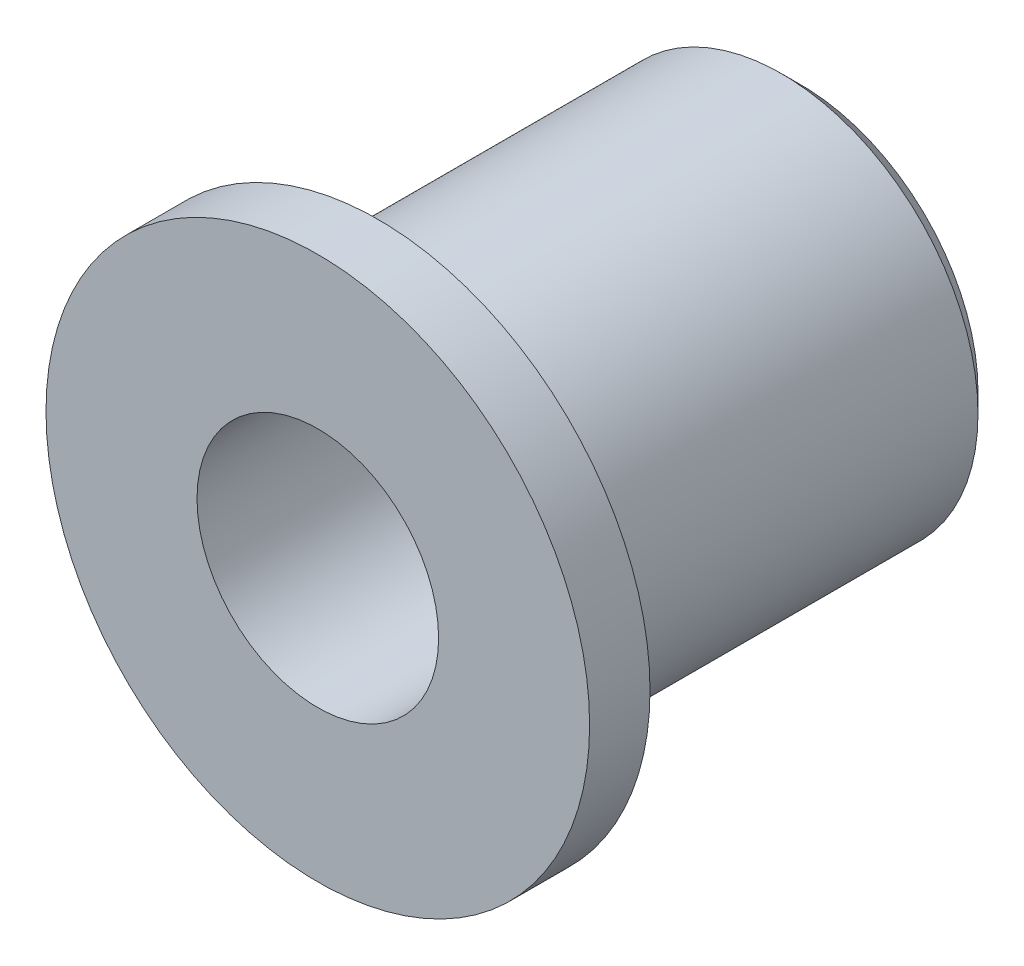
ISO-10303-21;
HEADER;
FILE_DESCRIPTION(('STEP AP214'),'2;1');
FILE_NAME('part.step','',(''),(''),'','','');
FILE_SCHEMA(('AUTOMOTIVE_DESIGN { 1 0 10303 214 1 1 1 1 }'));
ENDSEC;
DATA;
#1=APPLICATION_CONTEXT('core data for automotive mechanical design processes');
#2=APPLICATION_PROTOCOL_DEFINITION('international standard','automotive_design',2000,#1);
#3=PRODUCT_CONTEXT('',#1,'mechanical');
#4=PRODUCT('Part','Part','',(#3));
#5=PRODUCT_RELATED_PRODUCT_CATEGORY('part','',(#4));
#6=PRODUCT_DEFINITION_FORMATION('','',#4);
#7=PRODUCT_DEFINITION_CONTEXT('part definition',#1,'design');
#8=PRODUCT_DEFINITION('design','',#6,#7);
#9=PRODUCT_DEFINITION_SHAPE('','',#8);
#10=(LENGTH_UNIT() NAMED_UNIT(*) SI_UNIT(.MILLI.,.METRE.));
#11=(NAMED_UNIT(*) PLANE_ANGLE_UNIT() SI_UNIT($,.RADIAN.));
#12=(NAMED_UNIT(*) SI_UNIT($,.STERADIAN.) SOLID_ANGLE_UNIT());
#13=UNCERTAINTY_MEASURE_WITH_UNIT(LENGTH_MEASURE(1.E-05),#10,'distance_accuracy_value','');
#14=(GEOMETRIC_REPRESENTATION_CONTEXT(3) GLOBAL_UNCERTAINTY_ASSIGNED_CONTEXT((#13)) GLOBAL_UNIT_ASSIGNED_CONTEXT((#10,
#11,#12)) REPRESENTATION_CONTEXT('',''));
#15=CARTESIAN_POINT('',(0.,0.,0.));
#16=DIRECTION('',(0.,0.,1.));
#17=DIRECTION('',(1.,0.,0.));
#18=AXIS2_PLACEMENT_3D('',#15,#16,#17);
#19=CARTESIAN_POINT('',(0.,0.,0.));
#20=DIRECTION('',(0.,0.,1.));
#21=DIRECTION('',(1.,0.,0.));
#22=AXIS2_PLACEMENT_3D('',#19,#20,#21);
#23=PLANE('',#22);
#24=CARTESIAN_POINT('',(0.,0.,0.));
#25=DIRECTION('',(0.,0.,1.));
#26=DIRECTION('',(1.,0.,0.));
#27=AXIS2_PLACEMENT_3D('',#24,#25,#26);
#28=CIRCLE('',#27,3.175);
#29=CARTESIAN_POINT('',(3.175,0.,0.));
#30=VERTEX_POINT('',#29);
#31=EDGE_CURVE('E68',#30,#30,#28,.T.);
#32=ORIENTED_EDGE('',*,*,#31,.F.);
#33=EDGE_LOOP('',(#32));
#34=FACE_BOUND('',#33,.T.);
#35=CARTESIAN_POINT('',(0.,0.,0.));
#36=DIRECTION('',(0.,0.,-1.));
#37=DIRECTION('',(-1.,0.,0.));
#38=AXIS2_PLACEMENT_3D('',#35,#36,#37);
#39=CIRCLE('',#38,7.14375);
#40=CARTESIAN_POINT('',(-7.14375,0.,0.));
#41=VERTEX_POINT('',#40);
#42=EDGE_CURVE('E43',#41,#41,#39,.T.);
#43=ORIENTED_EDGE('',*,*,#42,.F.);
#44=EDGE_LOOP('',(#43));
#45=FACE_BOUND('',#44,.T.);
#46=ADVANCED_FACE('F32',(#34,#45),#23,.T.);
#47=CARTESIAN_POINT('',(0.,0.,0.));
#48=DIRECTION('',(0.,0.,-1.));
#49=DIRECTION('',(-1.,0.,0.));
#50=AXIS2_PLACEMENT_3D('',#47,#48,#49);
#51=CYLINDRICAL_SURFACE('',#50,7.14375);
#52=ORIENTED_EDGE('',*,*,#42,.T.);
#53=EDGE_LOOP('',(#52));
#54=FACE_BOUND('',#53,.T.);
#55=CARTESIAN_POINT('',(0.,0.,-1.5875));
#56=DIRECTION('',(0.,0.,-1.));
#57=DIRECTION('',(-1.,0.,0.));
#58=AXIS2_PLACEMENT_3D('',#55,#56,#57);
#59=CIRCLE('',#58,7.14375);
#60=CARTESIAN_POINT('',(-7.14375,0.,-1.5875));
#61=VERTEX_POINT('',#60);
#62=EDGE_CURVE('E47',#61,#61,#59,.T.);
#63=ORIENTED_EDGE('',*,*,#62,.F.);
#64=EDGE_LOOP('',(#63));
#65=FACE_BOUND('',#64,.T.);
#66=ADVANCED_FACE('F84',(#54,#65),#51,.T.);
#67=CARTESIAN_POINT('',(0.,5.4689375,-1.5875));
#68=DIRECTION('',(0.,0.,-1.));
#69=DIRECTION('',(-1.,0.,0.));
#70=AXIS2_PLACEMENT_3D('',#67,#68,#69);
#71=PLANE('',#70);
#72=ORIENTED_EDGE('',*,*,#62,.T.);
#73=EDGE_LOOP('',(#72));
#74=FACE_BOUND('',#73,.T.);
#75=CARTESIAN_POINT('',(0.,0.,-1.5875));
#76=DIRECTION('',(0.,0.,-1.));
#77=DIRECTION('',(-1.,0.,0.));
#78=AXIS2_PLACEMENT_3D('',#75,#76,#77);
#79=CIRCLE('',#78,5.4689375);
#80=CARTESIAN_POINT('',(-5.4689375,0.,-1.5875));
#81=VERTEX_POINT('',#80);
#82=EDGE_CURVE('E52',#81,#81,#79,.T.);
#83=ORIENTED_EDGE('',*,*,#82,.F.);
#84=EDGE_LOOP('',(#83));
#85=FACE_BOUND('',#84,.T.);
#86=ADVANCED_FACE('F89',(#74,#85),#71,.T.);
#87=CARTESIAN_POINT('',(0.,0.,0.));
#88=DIRECTION('',(0.,0.,-1.));
#89=DIRECTION('',(-1.,0.,0.));
#90=AXIS2_PLACEMENT_3D('',#87,#88,#89);
#91=CYLINDRICAL_SURFACE('',#90,5.4689375);
#92=ORIENTED_EDGE('',*,*,#82,.T.);
#93=EDGE_LOOP('',(#92));
#94=FACE_BOUND('',#93,.T.);
#95=CARTESIAN_POINT('',(0.,0.,-1.4843125));
#96=DIRECTION('',(0.,0.,-1.));
#97=DIRECTION('',(-1.,0.,0.));
#98=AXIS2_PLACEMENT_3D('',#95,#96,#97);
#99=CIRCLE('',#98,5.4689375);
#100=CARTESIAN_POINT('',(-5.4689375,0.,-1.4843125));
#101=VERTEX_POINT('',#100);
#102=EDGE_CURVE('E55',#101,#101,#99,.T.);
#103=ORIENTED_EDGE('',*,*,#102,.F.);
#104=EDGE_LOOP('',(#103));
#105=FACE_BOUND('',#104,.T.);
#106=ADVANCED_FACE('F95',(#94,#105),#91,.F.);
#107=CARTESIAN_POINT('',(0.,5.0561875,-1.4843125));
#108=DIRECTION('',(0.,0.,-1.));
#109=DIRECTION('',(-1.,0.,0.));
#110=AXIS2_PLACEMENT_3D('',#107,#108,#109);
#111=PLANE('',#110);
#112=ORIENTED_EDGE('',*,*,#102,.T.);
#113=EDGE_LOOP('',(#112));
#114=FACE_BOUND('',#113,.T.);
#115=CARTESIAN_POINT('',(0.,0.,-1.4843125));
#116=DIRECTION('',(0.,0.,-1.));
#117=DIRECTION('',(-1.,0.,0.));
#118=AXIS2_PLACEMENT_3D('',#115,#116,#117);
#119=CIRCLE('',#118,5.0561875);
#120=CARTESIAN_POINT('',(-5.0561875,0.,-1.4843125));
#121=VERTEX_POINT('',#120);
#122=EDGE_CURVE('E58',#121,#121,#119,.T.);
#123=ORIENTED_EDGE('',*,*,#122,.F.);
#124=EDGE_LOOP('',(#123));
#125=FACE_BOUND('',#124,.T.);
#126=ADVANCED_FACE('F101',(#114,#125),#111,.T.);
#127=CARTESIAN_POINT('',(0.,0.,0.));
#128=DIRECTION('',(0.,0.,-1.));
#129=DIRECTION('',(-1.,0.,0.));
#130=AXIS2_PLACEMENT_3D('',#127,#128,#129);
#131=CYLINDRICAL_SURFACE('',#130,5.0561875);
#132=ORIENTED_EDGE('',*,*,#122,.T.);
#133=EDGE_LOOP('',(#132));
#134=FACE_BOUND('',#133,.T.);
#135=CARTESIAN_POINT('',(0.,0.,-1.8970625));
#136=DIRECTION('',(0.,0.,-1.));
#137=DIRECTION('',(-1.,0.,0.));
#138=AXIS2_PLACEMENT_3D('',#135,#136,#137);
#139=CIRCLE('',#138,5.0561875);
#140=CARTESIAN_POINT('',(-5.0561875,0.,-1.8970625));
#141=VERTEX_POINT('',#140);
#142=EDGE_CURVE('E61',#141,#141,#139,.T.);
#143=ORIENTED_EDGE('',*,*,#142,.F.);
#144=EDGE_LOOP('',(#143));
#145=FACE_BOUND('',#144,.T.);
#146=ADVANCED_FACE('F107',(#134,#145),#131,.T.);
#147=CARTESIAN_POINT('',(0.,5.0561875,-1.8970625));
#148=DIRECTION('',(0.,0.,1.));
#149=DIRECTION('',(1.,0.,0.));
#150=AXIS2_PLACEMENT_3D('',#147,#148,#149);
#151=PLANE('',#150);
#152=ORIENTED_EDGE('',*,*,#142,.T.);
#153=EDGE_LOOP('',(#152));
#154=FACE_BOUND('',#153,.T.);
#155=CARTESIAN_POINT('',(0.,0.,-1.8970625));
#156=DIRECTION('',(0.,0.,-1.));
#157=DIRECTION('',(-1.,0.,0.));
#158=AXIS2_PLACEMENT_3D('',#155,#156,#157);
#159=CIRCLE('',#158,5.159375);
#160=CARTESIAN_POINT('',(-5.159375,0.,-1.8970625));
#161=VERTEX_POINT('',#160);
#162=EDGE_CURVE('E64',#161,#161,#159,.T.);
#163=ORIENTED_EDGE('',*,*,#162,.F.);
#164=EDGE_LOOP('',(#163));
#165=FACE_BOUND('',#164,.T.);
#166=ADVANCED_FACE('F113',(#154,#165),#151,.T.);
#167=CARTESIAN_POINT('',(0.,0.,0.));
#168=DIRECTION('',(0.,0.,-1.));
#169=DIRECTION('',(-1.,0.,0.));
#170=AXIS2_PLACEMENT_3D('',#167,#168,#169);
#171=CYLINDRICAL_SURFACE('',#170,5.159375);
#172=CARTESIAN_POINT('',(0.,0.,-12.192));
#173=DIRECTION('',(0.,0.,-1.));
#174=DIRECTION('',(-1.,0.,0.));
#175=AXIS2_PLACEMENT_3D('',#172,#173,#174);
#176=CIRCLE('',#175,5.159375);
#177=CARTESIAN_POINT('',(-5.159375,0.,-12.192));
#178=VERTEX_POINT('',#177);
#179=EDGE_CURVE('E10',#178,#178,#176,.F.);
#180=ORIENTED_EDGE('',*,*,#179,.T.);
#181=EDGE_LOOP('',(#180));
#182=FACE_BOUND('',#181,.T.);
#183=ORIENTED_EDGE('',*,*,#162,.T.);
#184=EDGE_LOOP('',(#183));
#185=FACE_BOUND('',#184,.T.);
#186=ADVANCED_FACE('F119',(#182,#185),#171,.T.);
#187=CARTESIAN_POINT('',(0.,5.159375,-12.7));
#188=DIRECTION('',(0.,0.,-1.));
#189=DIRECTION('',(-1.,0.,0.));
#190=AXIS2_PLACEMENT_3D('',#187,#188,#189);
#191=PLANE('',#190);
#192=CARTESIAN_POINT('',(0.,0.,-12.7));
#193=DIRECTION('',(0.,0.,-1.));
#194=DIRECTION('',(-1.,0.,0.));
#195=AXIS2_PLACEMENT_3D('',#192,#193,#194);
#196=CIRCLE('',#195,4.651375);
#197=CARTESIAN_POINT('',(-4.651375,0.,-12.7));
#198=VERTEX_POINT('',#197);
#199=EDGE_CURVE('E39',#198,#198,#196,.T.);
#200=ORIENTED_EDGE('',*,*,#199,.T.);
#201=EDGE_LOOP('',(#200));
#202=FACE_BOUND('',#201,.T.);
#203=CARTESIAN_POINT('',(0.,0.,-12.7));
#204=DIRECTION('',(0.,0.,1.));
#205=DIRECTION('',(1.,0.,0.));
#206=AXIS2_PLACEMENT_3D('',#203,#204,#205);
#207=CIRCLE('',#206,3.175);
#208=CARTESIAN_POINT('',(3.175,0.,-12.7));
#209=VERTEX_POINT('',#208);
#210=EDGE_CURVE('E67',#209,#209,#207,.T.);
#211=ORIENTED_EDGE('',*,*,#210,.T.);
#212=EDGE_LOOP('',(#211));
#213=FACE_BOUND('',#212,.T.);
#214=ADVANCED_FACE('F74',(#202,#213),#191,.T.);
#215=CARTESIAN_POINT('',(0.,0.,-12.7));
#216=DIRECTION('',(0.,0.,1.));
#217=DIRECTION('',(1.,0.,0.));
#218=AXIS2_PLACEMENT_3D('',#215,#216,#217);
#219=CYLINDRICAL_SURFACE('',#218,3.175);
#220=ORIENTED_EDGE('',*,*,#210,.F.);
#221=EDGE_LOOP('',(#220));
#222=FACE_BOUND('',#221,.T.);
#223=ORIENTED_EDGE('',*,*,#31,.T.);
#224=EDGE_LOOP('',(#223));
#225=FACE_BOUND('',#224,.T.);
#226=ADVANCED_FACE('F76',(#222,#225),#219,.F.);
#227=CARTESIAN_POINT('',(0.,0.,-12.7));
#228=DIRECTION('',(0.,0.,1.));
#229=DIRECTION('',(1.,0.,0.));
#230=AXIS2_PLACEMENT_3D('',#227,#228,#229);
#231=CONICAL_SURFACE('',#230,4.651375,0.785398163397447);
#232=ORIENTED_EDGE('',*,*,#179,.F.);
#233=EDGE_LOOP('',(#232));
#234=FACE_BOUND('',#233,.T.);
#235=ORIENTED_EDGE('',*,*,#199,.F.);
#236=EDGE_LOOP('',(#235));
#237=FACE_BOUND('',#236,.T.);
#238=ADVANCED_FACE('F34',(#234,#237),#231,.T.);
#239=CLOSED_SHELL('',(#46,#66,#86,#106,#126,#146,#166,#186,#214,#226,#238));
#240=MANIFOLD_SOLID_BREP('B2',#239);
#241=ADVANCED_BREP_SHAPE_REPRESENTATION('',(#18,#240),#14);
#242=SHAPE_DEFINITION_REPRESENTATION(#9,#241);
ENDSEC;
END-ISO-10303-21;
